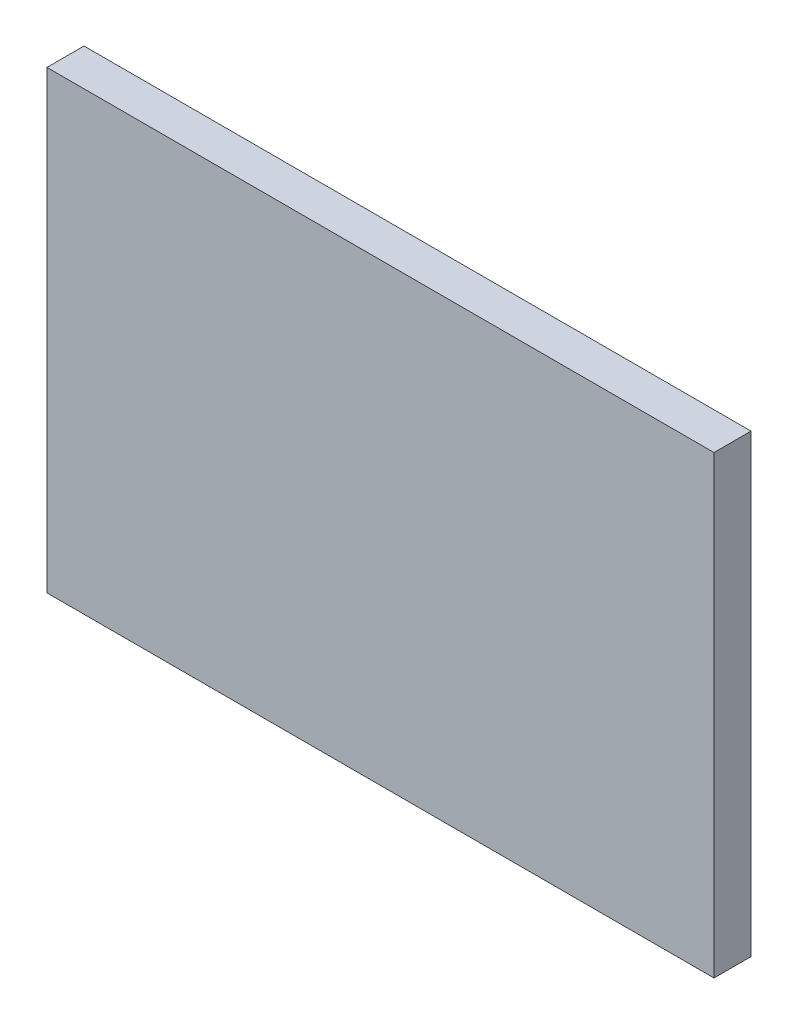
ISO-10303-21;
HEADER;
FILE_DESCRIPTION(('STEP AP214'),'2;1');
FILE_NAME('part.step','',(''),(''),'','','');
FILE_SCHEMA(('AUTOMOTIVE_DESIGN { 1 0 10303 214 1 1 1 1 }'));
ENDSEC;
DATA;
#1=APPLICATION_CONTEXT('core data for automotive mechanical design processes');
#2=APPLICATION_PROTOCOL_DEFINITION('international standard','automotive_design',2000,#1);
#3=PRODUCT_CONTEXT('',#1,'mechanical');
#4=PRODUCT('Part','Part','',(#3));
#5=PRODUCT_RELATED_PRODUCT_CATEGORY('part','',(#4));
#6=PRODUCT_DEFINITION_FORMATION('','',#4);
#7=PRODUCT_DEFINITION_CONTEXT('part definition',#1,'design');
#8=PRODUCT_DEFINITION('design','',#6,#7);
#9=PRODUCT_DEFINITION_SHAPE('','',#8);
#10=(LENGTH_UNIT() NAMED_UNIT(*) SI_UNIT(.MILLI.,.METRE.));
#11=(NAMED_UNIT(*) PLANE_ANGLE_UNIT() SI_UNIT($,.RADIAN.));
#12=(NAMED_UNIT(*) SI_UNIT($,.STERADIAN.) SOLID_ANGLE_UNIT());
#13=UNCERTAINTY_MEASURE_WITH_UNIT(LENGTH_MEASURE(1.E-05),#10,'distance_accuracy_value','');
#14=(GEOMETRIC_REPRESENTATION_CONTEXT(3) GLOBAL_UNCERTAINTY_ASSIGNED_CONTEXT((#13)) GLOBAL_UNIT_ASSIGNED_CONTEXT((#10,
#11,#12)) REPRESENTATION_CONTEXT('',''));
#15=CARTESIAN_POINT('',(0.,0.,0.));
#16=DIRECTION('',(0.,0.,1.));
#17=DIRECTION('',(1.,0.,0.));
#18=AXIS2_PLACEMENT_3D('',#15,#16,#17);
#19=CARTESIAN_POINT('',(57.15,38.989,6.35));
#20=DIRECTION('',(-1.,0.,0.));
#21=DIRECTION('',(0.,-1.,0.));
#22=AXIS2_PLACEMENT_3D('',#19,#20,#21);
#23=PLANE('',#22);
#24=DIRECTION('',(0.,1.,0.));
#25=VECTOR('',#24,1.);
#26=CARTESIAN_POINT('',(57.15,38.989,0.));
#27=LINE('',#26,#25);
#28=CARTESIAN_POINT('',(57.15,-38.989,0.));
#29=VERTEX_POINT('',#28);
#30=CARTESIAN_POINT('',(57.15,38.989,0.));
#31=VERTEX_POINT('',#30);
#32=EDGE_CURVE('E96',#29,#31,#27,.T.);
#33=ORIENTED_EDGE('',*,*,#32,.T.);
#34=DIRECTION('',(0.,0.,-1.));
#35=VECTOR('',#34,1.);
#36=CARTESIAN_POINT('',(57.15,38.989,6.35));
#37=LINE('',#36,#35);
#38=CARTESIAN_POINT('',(57.15,38.989,6.35));
#39=VERTEX_POINT('',#38);
#40=EDGE_CURVE('E11',#39,#31,#37,.T.);
#41=ORIENTED_EDGE('',*,*,#40,.F.);
#42=DIRECTION('',(0.,1.,0.));
#43=VECTOR('',#42,1.);
#44=CARTESIAN_POINT('',(57.15,38.989,6.35));
#45=LINE('',#44,#43);
#46=CARTESIAN_POINT('',(57.15,-38.989,6.35));
#47=VERTEX_POINT('',#46);
#48=EDGE_CURVE('E84',#47,#39,#45,.T.);
#49=ORIENTED_EDGE('',*,*,#48,.F.);
#50=DIRECTION('',(0.,0.,-1.));
#51=VECTOR('',#50,1.);
#52=CARTESIAN_POINT('',(57.15,-38.989,6.35));
#53=LINE('',#52,#51);
#54=EDGE_CURVE('E92',#47,#29,#53,.T.);
#55=ORIENTED_EDGE('',*,*,#54,.T.);
#56=EDGE_LOOP('',(#33,#41,#49,#55));
#57=FACE_BOUND('',#56,.T.);
#58=ADVANCED_FACE('F33',(#57),#23,.F.);
#59=CARTESIAN_POINT('',(-57.15,38.989,6.35));
#60=DIRECTION('',(0.,-1.,0.));
#61=DIRECTION('',(0.,0.,-1.));
#62=AXIS2_PLACEMENT_3D('',#59,#60,#61);
#63=PLANE('',#62);
#64=DIRECTION('',(-1.,0.,0.));
#65=VECTOR('',#64,1.);
#66=CARTESIAN_POINT('',(-57.15,38.989,0.));
#67=LINE('',#66,#65);
#68=CARTESIAN_POINT('',(-57.15,38.989,0.));
#69=VERTEX_POINT('',#68);
#70=EDGE_CURVE('E88',#31,#69,#67,.T.);
#71=ORIENTED_EDGE('',*,*,#70,.T.);
#72=DIRECTION('',(0.,0.,-1.));
#73=VECTOR('',#72,1.);
#74=CARTESIAN_POINT('',(-57.15,38.989,6.35));
#75=LINE('',#74,#73);
#76=CARTESIAN_POINT('',(-57.15,38.989,6.35));
#77=VERTEX_POINT('',#76);
#78=EDGE_CURVE('E41',#77,#69,#75,.T.);
#79=ORIENTED_EDGE('',*,*,#78,.F.);
#80=DIRECTION('',(-1.,0.,0.));
#81=VECTOR('',#80,1.);
#82=CARTESIAN_POINT('',(-57.15,38.989,6.35));
#83=LINE('',#82,#81);
#84=EDGE_CURVE('E79',#39,#77,#83,.T.);
#85=ORIENTED_EDGE('',*,*,#84,.F.);
#86=ORIENTED_EDGE('',*,*,#40,.T.);
#87=EDGE_LOOP('',(#71,#79,#85,#86));
#88=FACE_BOUND('',#87,.T.);
#89=ADVANCED_FACE('F87',(#88),#63,.F.);
#90=CARTESIAN_POINT('',(-57.15,38.989,6.35));
#91=DIRECTION('',(1.,0.,0.));
#92=DIRECTION('',(0.,1.,0.));
#93=AXIS2_PLACEMENT_3D('',#90,#91,#92);
#94=PLANE('',#93);
#95=DIRECTION('',(0.,-1.,0.));
#96=VECTOR('',#95,1.);
#97=CARTESIAN_POINT('',(-57.15,38.989,0.));
#98=LINE('',#97,#96);
#99=CARTESIAN_POINT('',(-57.15,-38.989,0.));
#100=VERTEX_POINT('',#99);
#101=EDGE_CURVE('E66',#69,#100,#98,.T.);
#102=ORIENTED_EDGE('',*,*,#101,.T.);
#103=DIRECTION('',(0.,0.,-1.));
#104=VECTOR('',#103,1.);
#105=CARTESIAN_POINT('',(-57.15,-38.989,6.35));
#106=LINE('',#105,#104);
#107=CARTESIAN_POINT('',(-57.15,-38.989,6.35));
#108=VERTEX_POINT('',#107);
#109=EDGE_CURVE('E89',#108,#100,#106,.T.);
#110=ORIENTED_EDGE('',*,*,#109,.F.);
#111=DIRECTION('',(0.,-1.,0.));
#112=VECTOR('',#111,1.);
#113=CARTESIAN_POINT('',(-57.15,38.989,6.35));
#114=LINE('',#113,#112);
#115=EDGE_CURVE('E82',#77,#108,#114,.T.);
#116=ORIENTED_EDGE('',*,*,#115,.F.);
#117=ORIENTED_EDGE('',*,*,#78,.T.);
#118=EDGE_LOOP('',(#102,#110,#116,#117));
#119=FACE_BOUND('',#118,.T.);
#120=ADVANCED_FACE('F90',(#119),#94,.F.);
#121=CARTESIAN_POINT('',(-57.15,-38.989,6.35));
#122=DIRECTION('',(0.,1.,0.));
#123=DIRECTION('',(0.,0.,1.));
#124=AXIS2_PLACEMENT_3D('',#121,#122,#123);
#125=PLANE('',#124);
#126=DIRECTION('',(1.,0.,0.));
#127=VECTOR('',#126,1.);
#128=CARTESIAN_POINT('',(-57.15,-38.989,0.));
#129=LINE('',#128,#127);
#130=EDGE_CURVE('E72',#100,#29,#129,.T.);
#131=ORIENTED_EDGE('',*,*,#130,.T.);
#132=ORIENTED_EDGE('',*,*,#54,.F.);
#133=DIRECTION('',(1.,0.,0.));
#134=VECTOR('',#133,1.);
#135=CARTESIAN_POINT('',(-57.15,-38.989,6.35));
#136=LINE('',#135,#134);
#137=EDGE_CURVE('E49',#108,#47,#136,.T.);
#138=ORIENTED_EDGE('',*,*,#137,.F.);
#139=ORIENTED_EDGE('',*,*,#109,.T.);
#140=EDGE_LOOP('',(#131,#132,#138,#139));
#141=FACE_BOUND('',#140,.T.);
#142=ADVANCED_FACE('F103',(#141),#125,.F.);
#143=CARTESIAN_POINT('',(0.,0.,6.35));
#144=DIRECTION('',(0.,0.,1.));
#145=DIRECTION('',(1.,0.,0.));
#146=AXIS2_PLACEMENT_3D('',#143,#144,#145);
#147=PLANE('',#146);
#148=ORIENTED_EDGE('',*,*,#48,.T.);
#149=ORIENTED_EDGE('',*,*,#84,.T.);
#150=ORIENTED_EDGE('',*,*,#115,.T.);
#151=ORIENTED_EDGE('',*,*,#137,.T.);
#152=EDGE_LOOP('',(#148,#149,#150,#151));
#153=FACE_BOUND('',#152,.T.);
#154=ADVANCED_FACE('F80',(#153),#147,.T.);
#155=CARTESIAN_POINT('',(0.,0.,0.));
#156=DIRECTION('',(0.,0.,1.));
#157=DIRECTION('',(1.,0.,0.));
#158=AXIS2_PLACEMENT_3D('',#155,#156,#157);
#159=PLANE('',#158);
#160=ORIENTED_EDGE('',*,*,#32,.F.);
#161=ORIENTED_EDGE('',*,*,#130,.F.);
#162=ORIENTED_EDGE('',*,*,#101,.F.);
#163=ORIENTED_EDGE('',*,*,#70,.F.);
#164=EDGE_LOOP('',(#160,#161,#162,#163));
#165=FACE_BOUND('',#164,.T.);
#166=ADVANCED_FACE('F106',(#165),#159,.F.);
#167=CLOSED_SHELL('',(#58,#89,#120,#142,#154,#166));
#168=MANIFOLD_SOLID_BREP('B2',#167);
#169=ADVANCED_BREP_SHAPE_REPRESENTATION('',(#18,#168),#14);
#170=SHAPE_DEFINITION_REPRESENTATION(#9,#169);
ENDSEC;
END-ISO-10303-21;
